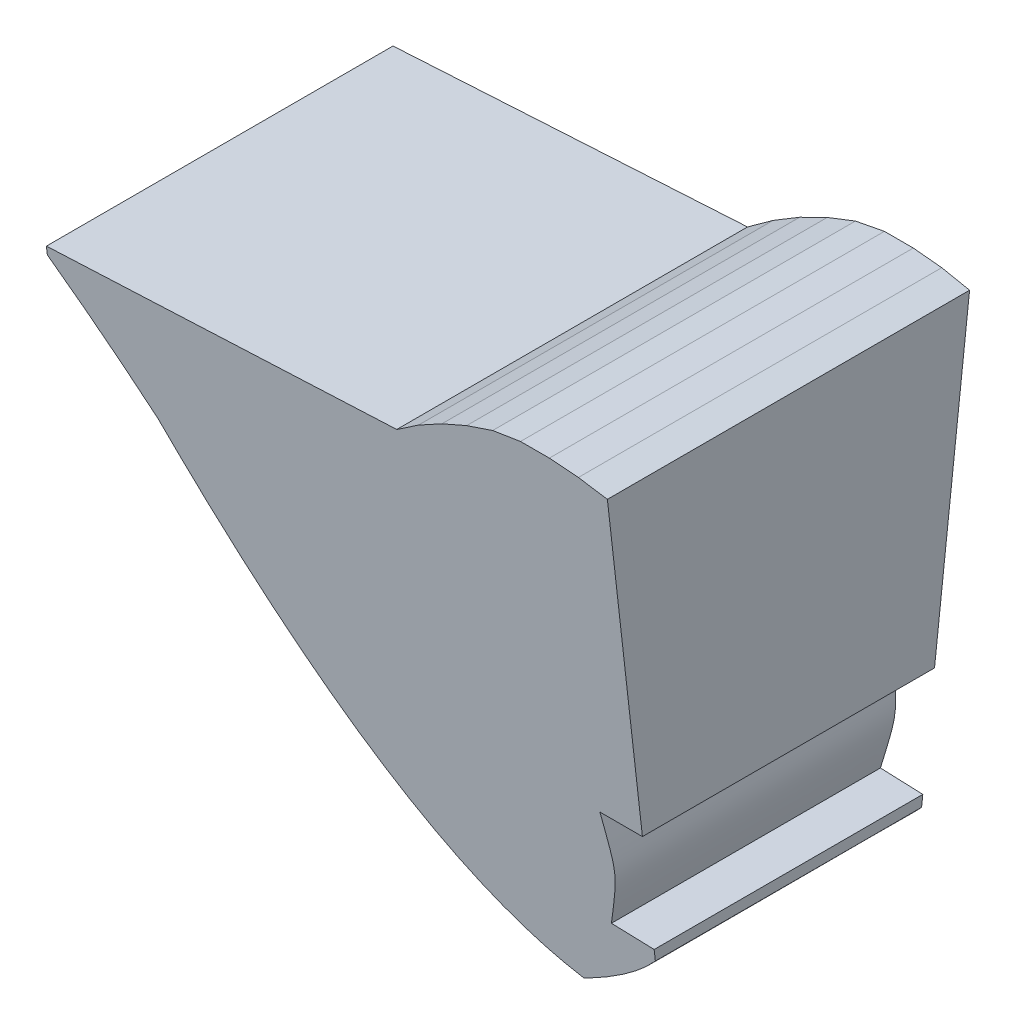
ISO-10303-21;
HEADER;
FILE_DESCRIPTION(('STEP AP214'),'2;1');
FILE_NAME('part.step','',(''),(''),'','','');
FILE_SCHEMA(('AUTOMOTIVE_DESIGN { 1 0 10303 214 1 1 1 1 }'));
ENDSEC;
DATA;
#1=APPLICATION_CONTEXT('core data for automotive mechanical design processes');
#2=APPLICATION_PROTOCOL_DEFINITION('international standard','automotive_design',2000,#1);
#3=PRODUCT_CONTEXT('',#1,'mechanical');
#4=PRODUCT('Part','Part','',(#3));
#5=PRODUCT_RELATED_PRODUCT_CATEGORY('part','',(#4));
#6=PRODUCT_DEFINITION_FORMATION('','',#4);
#7=PRODUCT_DEFINITION_CONTEXT('part definition',#1,'design');
#8=PRODUCT_DEFINITION('design','',#6,#7);
#9=PRODUCT_DEFINITION_SHAPE('','',#8);
#10=(LENGTH_UNIT() NAMED_UNIT(*) SI_UNIT(.MILLI.,.METRE.));
#11=(NAMED_UNIT(*) PLANE_ANGLE_UNIT() SI_UNIT($,.RADIAN.));
#12=(NAMED_UNIT(*) SI_UNIT($,.STERADIAN.) SOLID_ANGLE_UNIT());
#13=UNCERTAINTY_MEASURE_WITH_UNIT(LENGTH_MEASURE(1.E-05),#10,'distance_accuracy_value','');
#14=(GEOMETRIC_REPRESENTATION_CONTEXT(3) GLOBAL_UNCERTAINTY_ASSIGNED_CONTEXT((#13)) GLOBAL_UNIT_ASSIGNED_CONTEXT((#10,
#11,#12)) REPRESENTATION_CONTEXT('',''));
#15=CARTESIAN_POINT('',(0.,0.,0.));
#16=DIRECTION('',(0.,0.,1.));
#17=DIRECTION('',(1.,0.,0.));
#18=AXIS2_PLACEMENT_3D('',#15,#16,#17);
#19=CARTESIAN_POINT('',(0.355125000055651,-1.23774703808888E-13,7.21));
#20=DIRECTION('',(-1.,3.48538412642003E-13,0.));
#21=DIRECTION('',(-3.48538412642003E-13,-1.,0.));
#22=AXIS2_PLACEMENT_3D('',#19,#20,#21);
#23=PLANE('',#22);
#24=DIRECTION('',(0.,-0.993653373689782,0.112485434412263));
#25=VECTOR('',#24,1.);
#26=CARTESIAN_POINT('',(0.355125000056697,12.6081551722012,-7.21));
#27=LINE('',#26,#25);
#28=CARTESIAN_POINT('',(0.355125000056697,14.7091805414174,-7.44784426000575));
#29=VERTEX_POINT('',#28);
#30=CARTESIAN_POINT('',(0.355125000056447,1.97626956518499,-6.00642911422341));
#31=VERTEX_POINT('',#30);
#32=EDGE_CURVE('E58',#29,#31,#27,.T.);
#33=ORIENTED_EDGE('',*,*,#32,.F.);
#34=DIRECTION('',(0.,0.,-1.));
#35=VECTOR('',#34,1.);
#36=CARTESIAN_POINT('',(0.355125000056697,14.7091805414174,22.5387280312974));
#37=LINE('',#36,#35);
#38=CARTESIAN_POINT('',(0.355125000056697,14.7091805414174,7.44784426000575));
#39=VERTEX_POINT('',#38);
#40=EDGE_CURVE('E192',#39,#29,#37,.T.);
#41=ORIENTED_EDGE('',*,*,#40,.F.);
#42=DIRECTION('',(0.,0.993653373689782,0.112485434412263));
#43=VECTOR('',#42,1.);
#44=CARTESIAN_POINT('',(0.355125000056697,12.6081551722012,7.21));
#45=LINE('',#44,#43);
#46=CARTESIAN_POINT('',(0.355125000056697,1.97626956518499,6.00642911422342));
#47=VERTEX_POINT('',#46);
#48=EDGE_CURVE('E244',#47,#39,#45,.T.);
#49=ORIENTED_EDGE('',*,*,#48,.F.);
#50=DIRECTION('',(0.,0.,-1.));
#51=VECTOR('',#50,1.);
#52=CARTESIAN_POINT('',(0.355125000056447,1.97626956518499,7.21));
#53=LINE('',#52,#51);
#54=EDGE_CURVE('E316',#47,#31,#53,.T.);
#55=ORIENTED_EDGE('',*,*,#54,.T.);
#56=EDGE_LOOP('',(#33,#41,#49,#55));
#57=FACE_BOUND('',#56,.T.);
#58=ADVANCED_FACE('F43',(#57),#23,.F.);
#59=CARTESIAN_POINT('',(-23.0359211456035,0.,7.21));
#60=DIRECTION('',(-1.,0.,0.));
#61=DIRECTION('',(0.,0.,1.));
#62=AXIS2_PLACEMENT_3D('',#59,#60,#61);
#63=PLANE('',#62);
#64=DIRECTION('',(0.,0.,-1.));
#65=VECTOR('',#64,1.);
#66=CARTESIAN_POINT('',(-23.0359211456035,11.8716122879342,7.21));
#67=LINE('',#66,#65);
#68=CARTESIAN_POINT('',(-23.0359211456035,11.8716122879342,7.12662047501294));
#69=VERTEX_POINT('',#68);
#70=CARTESIAN_POINT('',(-23.0359211456035,11.8716122879342,-7.12662047501294));
#71=VERTEX_POINT('',#70);
#72=EDGE_CURVE('E325',#69,#71,#67,.T.);
#73=ORIENTED_EDGE('',*,*,#72,.T.);
#74=DIRECTION('',(0.,-0.993653373689782,0.112485434412263));
#75=VECTOR('',#74,1.);
#76=CARTESIAN_POINT('',(-23.0359211456035,12.6081551722012,-7.21));
#77=LINE('',#76,#75);
#78=CARTESIAN_POINT('',(-23.0359211456035,11.5401378200982,-7.08909627341673));
#79=VERTEX_POINT('',#78);
#80=EDGE_CURVE('E239',#71,#79,#77,.T.);
#81=ORIENTED_EDGE('',*,*,#80,.T.);
#82=DIRECTION('',(0.,0.,-1.));
#83=VECTOR('',#82,1.);
#84=CARTESIAN_POINT('',(-23.0359211456035,11.5401378200983,7.21));
#85=LINE('',#84,#83);
#86=CARTESIAN_POINT('',(-23.0359211456035,11.5401378200982,7.08909627341673));
#87=VERTEX_POINT('',#86);
#88=EDGE_CURVE('E319',#87,#79,#85,.T.);
#89=ORIENTED_EDGE('',*,*,#88,.F.);
#90=DIRECTION('',(0.,0.993653373689782,0.112485434412263));
#91=VECTOR('',#90,1.);
#92=CARTESIAN_POINT('',(-23.0359211456035,12.6081551722012,7.21));
#93=LINE('',#92,#91);
#94=EDGE_CURVE('E223',#87,#69,#93,.T.);
#95=ORIENTED_EDGE('',*,*,#94,.T.);
#96=EDGE_LOOP('',(#73,#81,#89,#95));
#97=FACE_BOUND('',#96,.T.);
#98=ADVANCED_FACE('F410',(#97),#63,.T.);
#99=CARTESIAN_POINT('',(-18.9451921135982,7.54091889574655,7.21));
#100=CARTESIAN_POINT('',(-10.2150083842792,-3.69764410322756,7.21));
#101=CARTESIAN_POINT('',(-2.84660482498738,-5.05908110388432,7.21));
#102=(BOUNDED_CURVE() B_SPLINE_CURVE(2,(#99,#100,#101),.UNSPECIFIED.,.F.,
.F.) B_SPLINE_CURVE_WITH_KNOTS((3,3),(0.497667241108509,0.499554279588011),
.UNSPECIFIED.) CURVE() GEOMETRIC_REPRESENTATION_ITEM() RATIONAL_B_SPLINE_CURVE((1.,1.,1.)) REPRESENTATION_ITEM(''));
#103=DIRECTION('',(0.,0.,-1.));
#104=VECTOR('',#103,1.);
#105=SURFACE_OF_LINEAR_EXTRUSION('',#102,#104);
#106=DIRECTION('',(0.,0.,-1.));
#107=VECTOR('',#106,1.);
#108=CARTESIAN_POINT('',(-18.9451921135982,7.54091889574657,7.21));
#109=LINE('',#108,#107);
#110=CARTESIAN_POINT('',(-18.9451921135982,7.54091889574657,6.63636910524442));
#111=VERTEX_POINT('',#110);
#112=CARTESIAN_POINT('',(-18.9451921135982,7.54091889574657,-6.63636910524442));
#113=VERTEX_POINT('',#112);
#114=EDGE_CURVE('E315',#111,#113,#109,.T.);
#115=ORIENTED_EDGE('',*,*,#114,.T.);
#116=CARTESIAN_POINT('',(-18.9451921135982,7.54091889574655,-6.63636910524441));
#117=CARTESIAN_POINT('',(-18.7033608655423,7.22962108931645,-6.60112898035273));
#118=CARTESIAN_POINT('',(-18.4592647140916,6.9200497206851,-6.56608429494821));
#119=CARTESIAN_POINT('',(-17.9661198805234,6.30464603742845,-6.49641819962467));
#120=CARTESIAN_POINT('',(-17.7170694462669,5.99881510969872,-6.46179694670763));
#121=CARTESIAN_POINT('',(-17.2137366178937,5.3913665824337,-6.39303140604553));
#122=CARTESIAN_POINT('',(-16.9594535947769,5.08974949683998,-6.35888717648066));
#123=CARTESIAN_POINT('',(-16.4451285665965,4.49103725761873,-6.29111061767257));
#124=CARTESIAN_POINT('',(-16.1850826962375,4.19394537928884,-6.25747865920581));
#125=CARTESIAN_POINT('',(-15.6590118901181,3.60508061675355,-6.1908168731366));
#126=CARTESIAN_POINT('',(-15.3929875534481,3.31330720485499,-6.15778698579723));
#127=CARTESIAN_POINT('',(-14.8544901847056,2.7357195544677,-6.09240181277284));
#128=CARTESIAN_POINT('',(-14.5820174931064,2.44990500284308,-6.06004649163962));
#129=CARTESIAN_POINT('',(-13.9777704357619,1.83142011947111,-5.99003159245484));
#130=CARTESIAN_POINT('',(-13.6445482479649,1.50014167377654,-5.95252958132897));
#131=CARTESIAN_POINT('',(-12.9673134934436,0.848664446736888,-5.87877982026175));
#132=CARTESIAN_POINT('',(-12.623301443116,0.528465136688492,-5.84253201046914));
#133=CARTESIAN_POINT('',(-11.9227759490938,-0.0995013958587514,-5.7714437516454));
#134=CARTESIAN_POINT('',(-11.5662405708663,-0.407244542107335,-5.73660602813964));
#135=CARTESIAN_POINT('',(-10.840142749037,-1.00720368374379,-5.66868831511867));
#136=CARTESIAN_POINT('',(-10.4705807273197,-1.29942018121482,-5.6356082687657));
#137=CARTESIAN_POINT('',(-9.71382699072171,-1.86779135556405,-5.57126643674768));
#138=CARTESIAN_POINT('',(-9.32650636654571,-2.14377746328672,-5.540023733768));
#139=CARTESIAN_POINT('',(-8.5360986768139,-2.67282289543975,-5.48013372902864));
#140=CARTESIAN_POINT('',(-8.13300835344273,-2.92587744631612,-5.45148696765387));
#141=CARTESIAN_POINT('',(-7.31201826568453,-3.40280761684766,-5.39749661363601));
#142=CARTESIAN_POINT('',(-6.89419365451789,-3.62680992502778,-5.37213867935817));
#143=CARTESIAN_POINT('',(-6.04187322097519,-4.0405536088069,-5.32530128189388));
#144=CARTESIAN_POINT('',(-5.60738935372736,-4.23031901573022,-5.30381909826786));
#145=CARTESIAN_POINT('',(-4.78985442909107,-4.54236533838515,-5.26849423842238));
#146=CARTESIAN_POINT('',(-4.4091055725695,-4.67052923075731,-5.25398558631979));
#147=CARTESIAN_POINT('',(-3.82960691198316,-4.83674345690554,-5.23516948814227));
#148=CARTESIAN_POINT('',(-3.63462104960687,-4.8878904691115,-5.22937944702812));
#149=CARTESIAN_POINT('',(-3.24229120544362,-4.9807402777546,-5.21886848683127));
#150=CARTESIAN_POINT('',(-3.0449461414238,-5.02243854990591,-5.21414807991536));
#151=CARTESIAN_POINT('',(-2.84660482498738,-5.05908110388432,-5.21));
#152=B_SPLINE_CURVE_WITH_KNOTS('',3,(#116,#117,#118,#119,#120,#121,#122,#123,#124,#125,#126,
#127,#128,#129,#130,#131,#132,#133,#134,#135,#136,#137,#138,#139,#140,#141,#142,#143,#144,#145,
#146,#147,#148,#149,#150,#151),.UNSPECIFIED.,.F.,.F.,(4,2,2,2,2,2,2,2,2,2,2,2,2,2,2,2,2,4),(0.,
1.1872997216569,2.37502708567824,3.56289806807204,4.75159146291787,5.9401662676152,
7.12867845491363,8.54255640265696,9.95636678593971,11.3727907462706,12.7891688759803,
14.2183172044781,15.6477623519031,17.0707480146133,18.4927309460623,19.6971402338765,
20.3019233237111,20.9069953892921),.UNSPECIFIED.);
#153=CARTESIAN_POINT('',(-2.84660482498738,-5.05908110388432,-5.21));
#154=VERTEX_POINT('',#153);
#155=EDGE_CURVE('E356',#113,#154,#152,.T.);
#156=ORIENTED_EDGE('',*,*,#155,.T.);
#157=DIRECTION('',(0.,0.,-1.));
#158=VECTOR('',#157,1.);
#159=CARTESIAN_POINT('',(-2.84660482498738,-5.05908110388432,7.21));
#160=LINE('',#159,#158);
#161=CARTESIAN_POINT('',(-2.84660482498738,-5.05908110388432,5.21));
#162=VERTEX_POINT('',#161);
#163=EDGE_CURVE('E340',#162,#154,#160,.T.);
#164=ORIENTED_EDGE('',*,*,#163,.F.);
#165=CARTESIAN_POINT('',(-2.84660482498738,-5.05908110388432,5.21));
#166=CARTESIAN_POINT('',(-3.0836355452615,-5.01529762547054,5.21495646039138));
#167=CARTESIAN_POINT('',(-3.31925014057108,-4.96428184629726,5.22073164541478));
#168=CARTESIAN_POINT('',(-3.78628189704186,-4.84911384389608,5.23376911212451));
#169=CARTESIAN_POINT('',(-4.01771143135529,-4.78501130060695,5.24102576984815));
#170=CARTESIAN_POINT('',(-4.47638324853452,-4.64477679089168,5.25690086287615));
#171=CARTESIAN_POINT('',(-4.70363211310206,-4.56866593727755,5.26551690812791));
#172=CARTESIAN_POINT('',(-5.1539801611568,-4.40545252874729,5.28399330205617));
#173=CARTESIAN_POINT('',(-5.37708095327682,-4.31835434125152,5.29385315632366));
#174=CARTESIAN_POINT('',(-5.81545834234536,-4.13567110279715,5.31453361087802));
#175=CARTESIAN_POINT('',(-6.03080317783365,-4.04024711994086,5.32533597762798));
#176=CARTESIAN_POINT('',(-6.45748946905634,-3.84057736608456,5.34793937192645));
#177=CARTESIAN_POINT('',(-6.66882789943329,-3.73632522989765,5.35974112003892));
#178=CARTESIAN_POINT('',(-7.08747417766979,-3.51983158147829,5.38424904476877));
#179=CARTESIAN_POINT('',(-7.29477947597257,-3.40758521204135,5.39695577124062));
#180=CARTESIAN_POINT('',(-7.70530843131035,-3.17590609220346,5.42318275051655));
#181=CARTESIAN_POINT('',(-7.90853147430462,-3.0564722713248,5.43670312450288));
#182=CARTESIAN_POINT('',(-8.45410340689061,-2.72385368196738,5.47435684511425));
#183=CARTESIAN_POINT('',(-8.79259906035209,-2.50440768840731,5.49919898682003));
#184=CARTESIAN_POINT('',(-9.45845448583479,-2.04949644973372,5.5506967119384));
#185=CARTESIAN_POINT('',(-9.78581359629267,-1.81403025542841,5.5773524028032));
#186=CARTESIAN_POINT('',(-10.4302582396863,-1.32938575303013,5.63221604925302));
#187=CARTESIAN_POINT('',(-10.7473396395034,-1.08020203459831,5.66042461730948));
#188=CARTESIAN_POINT('',(-11.3718438106499,-0.570176876647104,5.71816145288252));
#189=CARTESIAN_POINT('',(-11.6792662750814,-0.309335067346119,5.74768976225981));
#190=CARTESIAN_POINT('',(-12.2887351366992,0.225514030316342,5.80823676455314));
#191=CARTESIAN_POINT('',(-12.5906756597182,0.499640146613562,5.83926890925461));
#192=CARTESIAN_POINT('',(-13.1859914625247,1.05668157973797,5.90232817041119));
#193=CARTESIAN_POINT('',(-13.4793699933214,1.33959347409339,5.93435489942917));
#194=CARTESIAN_POINT('',(-14.0582984741035,1.91313890151101,5.99928247705986));
#195=CARTESIAN_POINT('',(-14.3438493181123,2.20377154523463,6.03218322499598));
#196=CARTESIAN_POINT('',(-14.9077244427009,2.7918210558895,6.09875272137508));
#197=CARTESIAN_POINT('',(-15.1860493084316,3.08923736980037,6.13242140721399));
#198=CARTESIAN_POINT('',(-15.7683607406539,3.72540309630891,6.20443784674841));
#199=CARTESIAN_POINT('',(-16.0715178451228,4.06490144250158,6.24287038264565));
#200=CARTESIAN_POINT('',(-16.6701836985208,4.7504922746204,6.32048193675692));
#201=CARTESIAN_POINT('',(-16.9656923307507,5.09658486102068,6.35966096634501));
#202=CARTESIAN_POINT('',(-17.4495199616275,5.67490501691598,6.42512906184765));
#203=CARTESIAN_POINT('',(-17.6398456690967,5.90547984199544,6.45123103065322));
#204=CARTESIAN_POINT('',(-18.0176052393411,6.36895711711416,6.50369846448112));
#205=CARTESIAN_POINT('',(-18.205039097963,6.60185957049552,6.5300639298818));
#206=CARTESIAN_POINT('',(-18.5771476687389,7.06981539005112,6.58303835239394));
#207=CARTESIAN_POINT('',(-18.7618224957771,7.30486866600559,6.60964729929217));
#208=CARTESIAN_POINT('',(-18.9451921135982,7.54091889574655,6.63636910524441));
#209=B_SPLINE_CURVE_WITH_KNOTS('',3,(#165,#166,#167,#168,#169,#170,#171,#172,#173,#174,#175,
#176,#177,#178,#179,#180,#181,#182,#183,#184,#185,#186,#187,#188,#189,#190,#191,#192,#193,#194,
#195,#196,#197,#198,#199,#200,#201,#202,#203,#204,#205,#206,#207,#208),.UNSPECIFIED.,.F.,.F.,(4,
2,2,2,2,2,2,2,2,2,2,2,2,2,2,2,2,2,2,2,2,4),(0.,0.723070627629283,1.44344574109941,
2.16256813451498,2.88140557514503,3.58855192345824,4.2962125448096,5.0043068623572,
5.71250690363926,6.92441762508089,8.13640021448464,9.3488642962315,10.5613668633146,
11.788141520998,13.0144441434254,14.2406061176645,15.4666684871313,16.8368576095009,
18.2070676256843,19.1073954524656,20.0077245721621,20.9080160976373),.UNSPECIFIED.);
#210=EDGE_CURVE('E274',#162,#111,#209,.T.);
#211=ORIENTED_EDGE('',*,*,#210,.T.);
#212=EDGE_LOOP('',(#115,#156,#164,#211));
#213=FACE_BOUND('',#212,.T.);
#214=ADVANCED_FACE('F44',(#213),#105,.F.);
#215=CARTESIAN_POINT('',(-2.84660482498738,-5.05908110388432,7.21));
#216=CARTESIAN_POINT('',(-0.742366881974002,-3.93520659958673,7.21));
#217=CARTESIAN_POINT('',(0.355124999965198,-2.72325322699678,7.21));
#218=(BOUNDED_CURVE() B_SPLINE_CURVE(2,(#215,#216,#217),.UNSPECIFIED.,.F.,
.F.) B_SPLINE_CURVE_WITH_KNOTS((3,3),(0.498812074629495,0.499412845463797),
.UNSPECIFIED.) CURVE() GEOMETRIC_REPRESENTATION_ITEM() RATIONAL_B_SPLINE_CURVE((1.,1.,1.)) REPRESENTATION_ITEM(''));
#219=DIRECTION('',(0.,0.,-1.));
#220=VECTOR('',#219,1.);
#221=SURFACE_OF_LINEAR_EXTRUSION('',#218,#220);
#222=ORIENTED_EDGE('',*,*,#163,.T.);
#223=CARTESIAN_POINT('',(-2.84660482498738,-5.05908110388432,-5.21));
#224=CARTESIAN_POINT('',(-2.67154367534484,-4.96554243060771,-5.22058894235803));
#225=CARTESIAN_POINT('',(-2.49778385523126,-4.86952307483158,-5.23145870764283));
#226=CARTESIAN_POINT('',(-2.15332890723938,-4.67164155861341,-5.25385966647147));
#227=CARTESIAN_POINT('',(-1.9826387176766,-4.56977092703724,-5.26539181898071));
#228=CARTESIAN_POINT('',(-1.64527137465746,-4.35955519460265,-5.2891890591545));
#229=CARTESIAN_POINT('',(-1.47859514121983,-4.25120862887406,-5.30145431264808));
#230=CARTESIAN_POINT('',(-1.15044448784201,-4.02724001195876,-5.32680843294344));
#231=CARTESIAN_POINT('',(-0.98896568487432,-3.911624347545,-5.33989657673763));
#232=CARTESIAN_POINT('',(-0.724614348138144,-3.7114805449727,-5.36255363519824));
#233=CARTESIAN_POINT('',(-0.619967455079453,-3.6292658395869,-5.37186066025876));
#234=CARTESIAN_POINT('',(-0.414118763296717,-3.46070156785231,-5.39094279275538));
#235=CARTESIAN_POINT('',(-0.312916415666604,-3.3743526656372,-5.40071782500895));
#236=CARTESIAN_POINT('',(-0.114288127047668,-3.19685300163986,-5.42081147873311));
#237=CARTESIAN_POINT('',(-0.0168745915935634,-3.10568844995875,-5.431131661274));
#238=CARTESIAN_POINT('',(0.173044677325633,-2.91833195578561,-5.45234114658855));
#239=CARTESIAN_POINT('',(0.265547074526193,-2.82213668167119,-5.46323082651485));
#240=CARTESIAN_POINT('',(0.355124999965198,-2.72325322699678,-5.47442481895704));
#241=B_SPLINE_CURVE_WITH_KNOTS('',3,(#223,#224,#225,#226,#227,#228,#229,#230,#231,#232,#233,
#234,#235,#236,#237,#238,#239,#240),.UNSPECIFIED.,.F.,.F.,(4,2,2,2,2,2,2,2,4),(0.,
0.596333361221147,1.19355295493407,1.79090815604603,2.38774565156578,2.78786762990545,
3.18792554534165,3.58919872466333,3.99074110013676),.UNSPECIFIED.);
#242=CARTESIAN_POINT('',(0.355125000010947,-2.72325322699678,-5.47442481895703));
#243=VERTEX_POINT('',#242);
#244=EDGE_CURVE('E362',#154,#243,#241,.T.);
#245=ORIENTED_EDGE('',*,*,#244,.T.);
#246=DIRECTION('',(0.,0.,-1.));
#247=VECTOR('',#246,1.);
#248=CARTESIAN_POINT('',(0.355124999965198,-2.72325322699678,7.21));
#249=LINE('',#248,#247);
#250=CARTESIAN_POINT('',(0.355125000010947,-2.72325322699678,5.47442481895703));
#251=VERTEX_POINT('',#250);
#252=EDGE_CURVE('E332',#251,#243,#249,.T.);
#253=ORIENTED_EDGE('',*,*,#252,.F.);
#254=CARTESIAN_POINT('',(0.355124999965198,-2.72325322699678,5.47442481895703));
#255=CARTESIAN_POINT('',(0.288265800066398,-2.79707578870119,5.46606781726749));
#256=CARTESIAN_POINT('',(0.219762299322532,-2.86939557158838,5.45788093599675));
#257=CARTESIAN_POINT('',(0.0798741499126208,-3.0111837154317,5.44182996553056));
#258=CARTESIAN_POINT('',(0.00849051694650479,-3.08065306448068,5.43396576447915));
#259=CARTESIAN_POINT('',(-0.209110404202349,-3.28478130911614,5.41085765164865));
#260=CARTESIAN_POINT('',(-0.359086186155244,-3.41549544786354,5.39606030171743));
#261=CARTESIAN_POINT('',(-0.666431647279958,-3.66745151891472,5.36753789253992));
#262=CARTESIAN_POINT('',(-0.823790135326829,-3.78870709059741,5.35381128926277));
#263=CARTESIAN_POINT('',(-1.14463764434189,-4.02329424679429,5.32725510893767));
#264=CARTESIAN_POINT('',(-1.30813354467851,-4.13661650521983,5.31442658763929));
#265=CARTESIAN_POINT('',(-1.58497175174893,-4.31986712055689,5.29368190381061));
#266=CARTESIAN_POINT('',(-1.69701528140079,-4.39175032218513,5.28554444523986));
#267=CARTESIAN_POINT('',(-1.92294333828473,-4.53261962763427,5.26959749086083));
#268=CARTESIAN_POINT('',(-2.03682799400811,-4.6016055280346,5.26178801808056));
#269=CARTESIAN_POINT('',(-2.26591352019373,-4.73675126913538,5.24648899349189));
#270=CARTESIAN_POINT('',(-2.38111062922232,-4.80291742324192,5.23899872698133));
#271=CARTESIAN_POINT('',(-2.6128736149529,-4.93278949726635,5.22429670205848));
#272=CARTESIAN_POINT('',(-2.72943923096306,-4.99649587614853,5.21708489168965));
#273=CARTESIAN_POINT('',(-2.84660482498738,-5.05908110388432,5.21));
#274=B_SPLINE_CURVE_WITH_KNOTS('',3,(#254,#255,#256,#257,#258,#259,#260,#261,#262,#263,#264,
#265,#266,#267,#268,#269,#270,#271,#272,#273),.UNSPECIFIED.,.F.,.F.,(4,2,2,2,2,2,2,2,2,4),(0.,
0.299782926841572,0.599461041577767,1.1974499434567,1.79455995327913,2.39236050766276,
2.79242459253001,3.19251671924541,3.59166012626068,3.99072869445439),.UNSPECIFIED.);
#275=EDGE_CURVE('E279',#251,#162,#274,.T.);
#276=ORIENTED_EDGE('',*,*,#275,.T.);
#277=EDGE_LOOP('',(#222,#245,#253,#276));
#278=FACE_BOUND('',#277,.T.);
#279=ADVANCED_FACE('F286',(#278),#221,.F.);
#280=CARTESIAN_POINT('',(0.355125000532009,-7.39148800447813E-11,7.21));
#281=DIRECTION('',(1.,-2.08137641489758E-10,0.));
#282=DIRECTION('',(2.08137641489758E-10,1.,0.));
#283=AXIS2_PLACEMENT_3D('',#280,#281,#282);
#284=PLANE('',#283);
#285=CARTESIAN_POINT('',(0.355125000056697,-2.28484178142546,-5.52405470319249));
#286=VERTEX_POINT('',#285);
#287=EDGE_CURVE('E240',#286,#243,#27,.T.);
#288=ORIENTED_EDGE('',*,*,#287,.F.);
#289=DIRECTION('',(0.,0.,-1.));
#290=VECTOR('',#289,1.);
#291=CARTESIAN_POINT('',(0.355125000056447,-2.28484178142545,7.21));
#292=LINE('',#291,#290);
#293=CARTESIAN_POINT('',(0.355125000056697,-2.28484178142546,5.52405470319249));
#294=VERTEX_POINT('',#293);
#295=EDGE_CURVE('E331',#294,#286,#292,.T.);
#296=ORIENTED_EDGE('',*,*,#295,.F.);
#297=EDGE_CURVE('E237',#251,#294,#45,.T.);
#298=ORIENTED_EDGE('',*,*,#297,.F.);
#299=ORIENTED_EDGE('',*,*,#252,.T.);
#300=EDGE_LOOP('',(#288,#296,#298,#299));
#301=FACE_BOUND('',#300,.T.);
#302=ADVANCED_FACE('F294',(#301),#284,.T.);
#303=CARTESIAN_POINT('',(-0.0792587195419091,-2.26967276768239,7.21));
#304=DIRECTION('',(-0.0348994967024901,-0.999390827019096,0.));
#305=DIRECTION('',(0.999390827019096,-0.0348994967024901,0.));
#306=AXIS2_PLACEMENT_3D('',#303,#304,#305);
#307=PLANE('',#306);
#308=ORIENTED_EDGE('',*,*,#295,.T.);
#309=DIRECTION('',(-0.999383027616045,0.034899224341334,-0.00395072820626436));
#310=VECTOR('',#309,1.);
#311=CARTESIAN_POINT('',(-0.0289741896082848,-2.2714287421612,-5.52557311151111));
#312=LINE('',#311,#310);
#313=CARTESIAN_POINT('',(-1.39487499994356,-2.22373043481491,-5.5309727457947));
#314=VERTEX_POINT('',#313);
#315=EDGE_CURVE('E347',#286,#314,#312,.T.);
#316=ORIENTED_EDGE('',*,*,#315,.T.);
#317=DIRECTION('',(0.,0.,-1.));
#318=VECTOR('',#317,1.);
#319=CARTESIAN_POINT('',(-1.39487499994356,-2.22373043481491,7.21));
#320=LINE('',#319,#318);
#321=CARTESIAN_POINT('',(-1.39487499994356,-2.22373043481491,5.5309727457947));
#322=VERTEX_POINT('',#321);
#323=EDGE_CURVE('E329',#322,#314,#320,.T.);
#324=ORIENTED_EDGE('',*,*,#323,.F.);
#325=DIRECTION('',(0.999383027616045,-0.034899224341334,-0.00395072820626436));
#326=VECTOR('',#325,1.);
#327=CARTESIAN_POINT('',(-0.0859085417339361,-2.26944055077446,5.52579818252456));
#328=LINE('',#327,#326);
#329=EDGE_CURVE('E251',#322,#294,#328,.T.);
#330=ORIENTED_EDGE('',*,*,#329,.T.);
#331=EDGE_LOOP('',(#308,#316,#324,#330));
#332=FACE_BOUND('',#331,.T.);
#333=ADVANCED_FACE('F420',(#332),#307,.F.);
#334=CARTESIAN_POINT('',(-1.39487499994356,-2.22373043481491,7.21));
#335=CARTESIAN_POINT('',(-0.907530669798052,-0.123730434814926,7.21));
#336=CARTESIAN_POINT('',(-1.39487499994356,1.976269565185,7.21));
#337=(BOUNDED_CURVE() B_SPLINE_CURVE(2,(#334,#335,#336),.UNSPECIFIED.,.F.,
.F.) B_SPLINE_CURVE_WITH_KNOTS((3,3),(0.,1.),
.UNSPECIFIED.) CURVE() GEOMETRIC_REPRESENTATION_ITEM() RATIONAL_B_SPLINE_CURVE((1.,
3.23180121851367,1.)) REPRESENTATION_ITEM(''));
#338=DIRECTION('',(0.,0.,-1.));
#339=VECTOR('',#338,1.);
#340=SURFACE_OF_LINEAR_EXTRUSION('',#337,#339);
#341=ORIENTED_EDGE('',*,*,#323,.T.);
#342=CARTESIAN_POINT('',(-1.39487499994356,-2.22373043481491,-5.5309727457947));
#343=CARTESIAN_POINT('',(-1.38202447122813,-2.16835021356968,-5.53724200266994));
#344=CARTESIAN_POINT('',(-1.36921744547373,-2.11295996104296,-5.54351239512535));
#345=CARTESIAN_POINT('',(-1.34371955909939,-2.00215267308472,-5.55605621196536));
#346=CARTESIAN_POINT('',(-1.33102869927897,-1.94673563747162,-5.56232963637053));
#347=CARTESIAN_POINT('',(-1.30579250980865,-1.83586894873068,-5.57488017761064));
#348=CARTESIAN_POINT('',(-1.29324717983284,-1.78041929567618,-5.58115729443729));
#349=CARTESIAN_POINT('',(-1.26834035470031,-1.66945670178657,-5.593718692514));
#350=CARTESIAN_POINT('',(-1.25597893242913,-1.61394374477822,-5.60000297559494));
#351=CARTESIAN_POINT('',(-1.23150428056634,-1.50286329328951,-5.61257771561119));
#352=CARTESIAN_POINT('',(-1.21939105277074,-1.44729579841754,-5.61886817259083));
#353=CARTESIAN_POINT('',(-1.19550012207595,-1.33608743052918,-5.63145739324204));
#354=CARTESIAN_POINT('',(-1.1837224309966,-1.2804465549999,-5.63775615719808));
#355=CARTESIAN_POINT('',(-1.15485704104805,-1.14125615214793,-5.65351305326002));
#356=CARTESIAN_POINT('',(-1.13805530724695,-1.05764770999797,-5.66297785475397));
#357=CARTESIAN_POINT('',(-1.10616760722362,-0.890046794372652,-5.68195093158457));
#358=CARTESIAN_POINT('',(-1.09108267359643,-0.806054121054038,-5.69145922954426));
#359=CARTESIAN_POINT('',(-1.06839764881353,-0.664871544058104,-5.70744164748328));
#360=CARTESIAN_POINT('',(-1.05995626751594,-0.607817685780514,-5.71390036659317));
#361=CARTESIAN_POINT('',(-1.04516806244473,-0.493450404650502,-5.72684718853439));
#362=CARTESIAN_POINT('',(-1.03882061818002,-0.436137063802354,-5.73333528208253));
#363=CARTESIAN_POINT('',(-1.02903068414648,-0.32130807468907,-5.74633437116685));
#364=CARTESIAN_POINT('',(-1.02558541499307,-0.263792673078832,-5.75284533878074));
#365=CARTESIAN_POINT('',(-1.02222407231355,-0.148714957691158,-5.76587258464866));
#366=CARTESIAN_POINT('',(-1.02230420900467,-0.0911527608046728,-5.77238884967019));
#367=CARTESIAN_POINT('',(-1.02596900528622,0.0239015023985969,-5.78541344065945));
#368=CARTESIAN_POINT('',(-1.02955657044098,0.0813934710005598,-5.79192175556548));
#369=CARTESIAN_POINT('',(-1.03959132289802,0.19613338530381,-5.80491076103415));
#370=CARTESIAN_POINT('',(-1.04603929917214,0.253381259276289,-5.81139144347682));
#371=CARTESIAN_POINT('',(-1.05997220439613,0.35983137212623,-5.8234420111136));
#372=CARTESIAN_POINT('',(-1.06719667195452,0.409068491171902,-5.82901584487869));
#373=CARTESIAN_POINT('',(-1.08274764683563,0.507347946837772,-5.84014146227917));
#374=CARTESIAN_POINT('',(-1.0910737056158,0.556390354412903,-5.84569325394695));
#375=CARTESIAN_POINT('',(-1.10853037258208,0.654424381213792,-5.85679108784343));
#376=CARTESIAN_POINT('',(-1.11766242226862,0.70341574413319,-5.86233710105724));
#377=CARTESIAN_POINT('',(-1.1364977866421,0.801294033672846,-5.8734173048888));
#378=CARTESIAN_POINT('',(-1.14620115522269,0.850180949988233,-5.87895149433999));
#379=CARTESIAN_POINT('',(-1.16833495400599,0.959258362431623,-5.89129948252998));
#380=CARTESIAN_POINT('',(-1.1808737668477,1.01942705832357,-5.89811081339709));
#381=CARTESIAN_POINT('',(-1.20639174214038,1.13967062360228,-5.91172285360526));
#382=CARTESIAN_POINT('',(-1.21937089694786,1.19974549459873,-5.91852356312855));
#383=CARTESIAN_POINT('',(-1.24564626429316,1.31982703510014,-5.93211726150049));
#384=CARTESIAN_POINT('',(-1.2589424791072,1.37983370411223,-5.93891025029334));
#385=CARTESIAN_POINT('',(-1.28569888355067,1.49948275843749,-5.95245498954463));
#386=CARTESIAN_POINT('',(-1.29915785770072,1.55912541262012,-5.95920677044014));
#387=CARTESIAN_POINT('',(-1.32625009614692,1.67837055204035,-5.97270578495002));
#388=CARTESIAN_POINT('',(-1.33988335761136,1.73797303791406,-5.97945301863641));
#389=CARTESIAN_POINT('',(-1.36728618039678,1.85714403003134,-5.99294363938264));
#390=CARTESIAN_POINT('',(-1.381055735056,1.91671253778666,-5.9996870266136));
#391=CARTESIAN_POINT('',(-1.39487499994356,1.976269565185,-6.00642911422342));
#392=B_SPLINE_CURVE_WITH_KNOTS('',3,(#342,#343,#344,#345,#346,#347,#348,#349,#350,#351,#352,
#353,#354,#355,#356,#357,#358,#359,#360,#361,#362,#363,#364,#365,#366,#367,#368,#369,#370,#371,
#372,#373,#374,#375,#376,#377,#378,#379,#380,#381,#382,#383,#384,#385,#386,#387,#388,#389,#390,
#391),.UNSPECIFIED.,.F.,.F.,(4,2,2,2,2,2,2,2,2,2,2,2,2,2,2,2,2,2,2,2,2,2,2,2,4),(0.,
0.171588763273453,0.343178706622211,0.514768265617105,0.686424107910212,0.858081191922479,
1.02974431538338,1.28714724145325,1.54470417716685,1.71878537631805,1.8928149439917,
2.06667765516018,2.24035346989174,2.41417328020677,2.58804106414591,2.73825198714263,
2.88840193486919,3.03882608638502,3.18926445051695,3.37477476712053,3.56028186526787,
3.74579029559563,3.93033206952695,4.11487084894101,4.29940065253389),.UNSPECIFIED.);
#393=CARTESIAN_POINT('',(-1.39487499994356,1.976269565185,-6.00642911422342));
#394=VERTEX_POINT('',#393);
#395=EDGE_CURVE('E350',#314,#394,#392,.T.);
#396=ORIENTED_EDGE('',*,*,#395,.T.);
#397=DIRECTION('',(0.,0.,-1.));
#398=VECTOR('',#397,1.);
#399=CARTESIAN_POINT('',(-1.39487499994356,1.976269565185,7.21));
#400=LINE('',#399,#398);
#401=CARTESIAN_POINT('',(-1.39487499994356,1.976269565185,6.00642911422342));
#402=VERTEX_POINT('',#401);
#403=EDGE_CURVE('E324',#402,#394,#400,.T.);
#404=ORIENTED_EDGE('',*,*,#403,.F.);
#405=CARTESIAN_POINT('',(-1.39487499994356,1.976269565185,6.00642911422342));
#406=CARTESIAN_POINT('',(-1.37907511533365,1.90817072448153,5.99872006005792));
#407=CARTESIAN_POINT('',(-1.36333836969219,1.84005724657732,5.99100934890426));
#408=CARTESIAN_POINT('',(-1.33204781411177,1.703774616767,5.97558162408294));
#409=CARTESIAN_POINT('',(-1.31649404111311,1.63560545649229,5.96786460946793));
#410=CARTESIAN_POINT('',(-1.28563112684324,1.49920642241426,5.95242370722985));
#411=CARTESIAN_POINT('',(-1.27032200601989,1.43097654403409,5.94469981908867));
#412=CARTESIAN_POINT('',(-1.2399275173513,1.29390485970128,5.92918277022027));
#413=CARTESIAN_POINT('',(-1.22484485449072,1.22506245970345,5.92138954224482));
#414=CARTESIAN_POINT('',(-1.19518112320204,1.0872751663326,5.90579148364441));
#415=CARTESIAN_POINT('',(-1.18060002365467,1.01833027959621,5.89798665377074));
#416=CARTESIAN_POINT('',(-1.1521828568661,0.880291295746957,5.88236010282727));
#417=CARTESIAN_POINT('',(-1.13834675067045,0.81119720663251,5.87453838266293));
#418=CARTESIAN_POINT('',(-1.11516473949854,0.690174385789182,5.86083812768789));
#419=CARTESIAN_POINT('',(-1.10556404533104,0.638294159941606,5.85496508393199));
#420=CARTESIAN_POINT('',(-1.08728934318226,0.534373551286744,5.8432008660282));
#421=CARTESIAN_POINT('',(-1.07861528667302,0.482333177013413,5.83730969284637));
#422=CARTESIAN_POINT('',(-1.06260440200736,0.378149691610768,5.82551571627023));
#423=CARTESIAN_POINT('',(-1.05526500549272,0.326006977236309,5.81961295779011));
#424=CARTESIAN_POINT('',(-1.04244257361275,0.221494061638693,5.80778168843203));
#425=CARTESIAN_POINT('',(-1.03695934618146,0.169123884520429,5.80185318028283));
#426=CARTESIAN_POINT('',(-1.02917052981484,0.0729301509045451,5.79096367474698));
#427=CARTESIAN_POINT('',(-1.02648754730517,0.029137538921467,5.78600618039996));
#428=CARTESIAN_POINT('',(-1.02311803398459,-0.0585228047861233,5.77608268785843));
#429=CARTESIAN_POINT('',(-1.02243133042271,-0.10239052968188,5.77111669043696));
#430=CARTESIAN_POINT('',(-1.02313587995194,-0.190112899664058,5.76118617627941));
#431=CARTESIAN_POINT('',(-1.02452732528276,-0.233967543165022,5.75622165972282));
#432=CARTESIAN_POINT('',(-1.02922830316647,-0.321575626235211,5.74630408328911));
#433=CARTESIAN_POINT('',(-1.03253802615093,-0.365329055323648,5.74135102459847));
#434=CARTESIAN_POINT('',(-1.04481913269156,-0.496026010219698,5.72655561994619));
#435=CARTESIAN_POINT('',(-1.05614963950478,-0.582745183351363,5.71673867158183));
#436=CARTESIAN_POINT('',(-1.08246686740171,-0.755641929816293,5.69716608606103));
#437=CARTESIAN_POINT('',(-1.09745579058543,-0.84181914476287,5.68741048947536));
#438=CARTESIAN_POINT('',(-1.129420439335,-1.01366509487317,5.66795685819712));
#439=CARTESIAN_POINT('',(-1.14639302616418,-1.09933441387988,5.65825875741124));
#440=CARTESIAN_POINT('',(-1.18149622255001,-1.27039766561497,5.63889373063944));
#441=CARTESIAN_POINT('',(-1.19962634896168,-1.35579169781193,5.62922679339328));
#442=CARTESIAN_POINT('',(-1.24641099322308,-1.57177275123237,5.60477689641502));
#443=CARTESIAN_POINT('',(-1.2755379218154,-1.70225834502177,5.59000541866374));
#444=CARTESIAN_POINT('',(-1.31987060164556,-1.89787014932725,5.56786140006925));
#445=CARTESIAN_POINT('',(-1.33475842772637,-1.96306843680887,5.56048069983263));
#446=CARTESIAN_POINT('',(-1.36470186719661,-2.09342597092531,5.54572371893541));
#447=CARTESIAN_POINT('',(-1.37975747811874,-2.15858521811941,5.53834743821149));
#448=CARTESIAN_POINT('',(-1.39487499994356,-2.22373043481491,5.5309727457947));
#449=B_SPLINE_CURVE_WITH_KNOTS('',3,(#405,#406,#407,#408,#409,#410,#411,#412,#413,#414,#415,
#416,#417,#418,#419,#420,#421,#422,#423,#424,#425,#426,#427,#428,#429,#430,#431,#432,#433,#434,
#435,#436,#437,#438,#439,#440,#441,#442,#443,#444,#445,#446,#447,#448),.UNSPECIFIED.,.F.,.F.,(4,
2,2,2,2,2,2,2,2,2,2,2,2,2,2,2,2,2,2,2,2,4),(0.,0.210994688118994,0.422031267037357,
0.633085392962154,0.845798629208893,1.05849864386888,1.27118752598179,1.4304428147189,
1.58968975917224,1.7486269361582,1.90754766218714,2.03996993828288,2.1723807546786,
2.3048038205294,2.43724003455642,2.70109168787962,2.96510255404671,3.22870119353186,
3.49219051999256,3.89571487778355,4.09756249770236,4.29940715332609),.UNSPECIFIED.);
#450=EDGE_CURVE('E70',#402,#322,#449,.T.);
#451=ORIENTED_EDGE('',*,*,#450,.T.);
#452=EDGE_LOOP('',(#341,#396,#404,#451));
#453=FACE_BOUND('',#452,.T.);
#454=ADVANCED_FACE('F256',(#453),#340,.F.);
#455=CARTESIAN_POINT('',(-0.683557287645435,13.0430500394562,7.21));
#456=DIRECTION('',(0.0523359562429403,-0.998629534754574,0.));
#457=DIRECTION('',(0.998629534754574,0.0523359562429403,0.));
#458=AXIS2_PLACEMENT_3D('',#455,#456,#457);
#459=PLANE('',#458);
#460=DIRECTION('',(0.998612008623237,0.0523350377373175,0.00592453023432517));
#461=VECTOR('',#460,1.);
#462=CARTESIAN_POINT('',(-0.683848558053945,13.0430347746209,7.25923006582624));
#463=LINE('',#462,#461);
#464=CARTESIAN_POINT('',(-8.54137771045794,12.6312391210917,7.21261319297821));
#465=VERTEX_POINT('',#464);
#466=EDGE_CURVE('E288',#69,#465,#463,.T.);
#467=ORIENTED_EDGE('',*,*,#466,.T.);
#468=DIRECTION('',(0.,0.,-1.));
#469=VECTOR('',#468,1.);
#470=CARTESIAN_POINT('',(-8.54137771045794,12.6312391210917,22.5387280312974));
#471=LINE('',#470,#469);
#472=CARTESIAN_POINT('',(-8.54137771045794,12.6312391210917,-7.21261319297821));
#473=VERTEX_POINT('',#472);
#474=EDGE_CURVE('E200',#465,#473,#471,.T.);
#475=ORIENTED_EDGE('',*,*,#474,.T.);
#476=DIRECTION('',(-0.998612008623237,-0.0523350377373175,0.00592453023432517));
#477=VECTOR('',#476,1.);
#478=CARTESIAN_POINT('',(-0.769161705533953,13.0385637020178,-7.25872392298271));
#479=LINE('',#478,#477);
#480=EDGE_CURVE('E375',#473,#71,#479,.T.);
#481=ORIENTED_EDGE('',*,*,#480,.T.);
#482=ORIENTED_EDGE('',*,*,#72,.F.);
#483=EDGE_LOOP('',(#467,#475,#481,#482));
#484=FACE_BOUND('',#483,.T.);
#485=ADVANCED_FACE('F407',(#484),#459,.F.);
#486=CARTESIAN_POINT('',(-69.8841339427642,-40.4718315495759,7.21));
#487=DIRECTION('',(0.,0.,-1.));
#488=DIRECTION('',(-1.,0.,0.));
#489=AXIS2_PLACEMENT_3D('',#486,#487,#488);
#490=CYLINDRICAL_SURFACE('',#489,69.9999999999998);
#491=CARTESIAN_POINT('',(-69.8841339427642,-40.4718315495759,-1.20113863738535));
#492=DIRECTION('',(0.,0.112485434412263,0.993653373689781));
#493=DIRECTION('',(0.,0.993653373689782,-0.112485434412263));
#494=AXIS2_PLACEMENT_3D('',#491,#492,#493);
#495=ELLIPSE('',#494,70.4471014273976,69.9999999999998);
#496=EDGE_CURVE('E349',#113,#79,#495,.T.);
#497=ORIENTED_EDGE('',*,*,#496,.F.);
#498=ORIENTED_EDGE('',*,*,#114,.F.);
#499=CARTESIAN_POINT('',(-69.8841339427642,-40.4718315495759,1.20113863738535));
#500=DIRECTION('',(0.,0.112485434412263,-0.993653373689781));
#501=DIRECTION('',(0.,-0.993653373689782,-0.112485434412263));
#502=AXIS2_PLACEMENT_3D('',#499,#500,#501);
#503=ELLIPSE('',#502,70.4471014273976,69.9999999999998);
#504=EDGE_CURVE('E281',#87,#111,#503,.T.);
#505=ORIENTED_EDGE('',*,*,#504,.F.);
#506=ORIENTED_EDGE('',*,*,#88,.T.);
#507=EDGE_LOOP('',(#497,#498,#505,#506));
#508=FACE_BOUND('',#507,.T.);
#509=ADVANCED_FACE('F415',(#508),#490,.F.);
#510=CARTESIAN_POINT('',(-1.39487499994356,1.976269565185,7.21));
#511=DIRECTION('',(0.,1.,0.));
#512=DIRECTION('',(-1.,0.,0.));
#513=AXIS2_PLACEMENT_3D('',#510,#511,#512);
#514=PLANE('',#513);
#515=ORIENTED_EDGE('',*,*,#403,.T.);
#516=DIRECTION('',(1.,0.,0.));
#517=VECTOR('',#516,1.);
#518=CARTESIAN_POINT('',(-1.39487499994355,1.976269565185,-6.00642911422342));
#519=LINE('',#518,#517);
#520=EDGE_CURVE('E11',#394,#31,#519,.T.);
#521=ORIENTED_EDGE('',*,*,#520,.T.);
#522=ORIENTED_EDGE('',*,*,#54,.F.);
#523=DIRECTION('',(-1.,0.,0.));
#524=VECTOR('',#523,1.);
#525=CARTESIAN_POINT('',(-1.39487499994356,1.976269565185,6.00642911422342));
#526=LINE('',#525,#524);
#527=EDGE_CURVE('E52',#47,#402,#526,.T.);
#528=ORIENTED_EDGE('',*,*,#527,.T.);
#529=EDGE_LOOP('',(#515,#521,#522,#528));
#530=FACE_BOUND('',#529,.T.);
#531=ADVANCED_FACE('F266',(#530),#514,.F.);
#532=CARTESIAN_POINT('',(-23.0359211456035,12.6081551722012,7.21));
#533=DIRECTION('',(0.,0.112485434412263,-0.993653373689781));
#534=DIRECTION('',(0.,0.993653373689782,0.112485434412263));
#535=AXIS2_PLACEMENT_3D('',#532,#533,#534);
#536=PLANE('',#535);
#537=DIRECTION('',(0.817430693924938,0.572371133850233,0.0647946430223495));
#538=VECTOR('',#537,1.);
#539=CARTESIAN_POINT('',(-7.72962804552304,13.1996323556183,7.27695752229427));
#540=LINE('',#539,#538);
#541=CARTESIAN_POINT('',(-7.56930888441678,13.3118890407443,7.28966541654234));
#542=VERTEX_POINT('',#541);
#543=EDGE_CURVE('E203',#465,#542,#540,.T.);
#544=ORIENTED_EDGE('',*,*,#543,.F.);
#545=ORIENTED_EDGE('',*,*,#466,.F.);
#546=ORIENTED_EDGE('',*,*,#94,.F.);
#547=ORIENTED_EDGE('',*,*,#504,.T.);
#548=ORIENTED_EDGE('',*,*,#210,.F.);
#549=ORIENTED_EDGE('',*,*,#275,.F.);
#550=ORIENTED_EDGE('',*,*,#297,.T.);
#551=ORIENTED_EDGE('',*,*,#329,.F.);
#552=ORIENTED_EDGE('',*,*,#450,.F.);
#553=ORIENTED_EDGE('',*,*,#527,.F.);
#554=ORIENTED_EDGE('',*,*,#48,.T.);
#555=DIRECTION('',(0.984617531847521,-0.173614636543298,-0.0196538534754645));
#556=VECTOR('',#555,1.);
#557=CARTESIAN_POINT('',(-1.10510388429971,14.9666582917392,7.47699174479605));
#558=LINE('',#557,#556);
#559=CARTESIAN_POINT('',(-0.813523632417546,14.9152448262906,7.4711715401364));
#560=VERTEX_POINT('',#559);
#561=EDGE_CURVE('E222',#560,#39,#558,.T.);
#562=ORIENTED_EDGE('',*,*,#561,.F.);
#563=DIRECTION('',(0.996146214219524,-0.0871515009584786,-0.0098658895592456));
#564=VECTOR('',#563,1.);
#565=CARTESIAN_POINT('',(-2.14365178756719,15.0316159609029,7.48434520610132));
#566=LINE('',#565,#564);
#567=CARTESIAN_POINT('',(-1.99568488982245,15.0186705347731,7.48287973341194));
#568=VERTEX_POINT('',#567);
#569=EDGE_CURVE('E217',#568,#560,#566,.T.);
#570=ORIENTED_EDGE('',*,*,#569,.F.);
#571=DIRECTION('',(1.,0.,0.));
#572=VECTOR('',#571,1.);
#573=CARTESIAN_POINT('',(-3.18236181118069,15.0186705347731,7.48287973341194));
#574=LINE('',#573,#572);
#575=CARTESIAN_POINT('',(-3.18236181118068,15.0186705347731,7.48287973341194));
#576=VERTEX_POINT('',#575);
#577=EDGE_CURVE('E174',#576,#568,#574,.T.);
#578=ORIENTED_EDGE('',*,*,#577,.F.);
#579=DIRECTION('',(0.984617531847522,0.173614636543291,0.0196538534754637));
#580=VECTOR('',#579,1.);
#581=CARTESIAN_POINT('',(-4.05920534468003,14.8640593619575,7.46537714609159));
#582=LINE('',#581,#580);
#583=CARTESIAN_POINT('',(-4.35101044365493,14.8126062498999,7.45955245328129));
#584=VERTEX_POINT('',#583);
#585=EDGE_CURVE('E214',#584,#576,#582,.T.);
#586=ORIENTED_EDGE('',*,*,#585,.F.);
#587=DIRECTION('',(0.938989072354552,0.341764072638288,0.0386890249609558));
#588=VECTOR('',#587,1.);
#589=CARTESIAN_POINT('',(-4.91664793508236,14.6067310396353,7.43624657713322));
#590=LINE('',#589,#588);
#591=CARTESIAN_POINT('',(-5.4661219899122,14.4067388391757,7.4136066806226));
#592=VERTEX_POINT('',#591);
#593=EDGE_CURVE('E215',#592,#584,#590,.T.);
#594=ORIENTED_EDGE('',*,*,#593,.F.);
#595=DIRECTION('',(0.905272358230747,0.422135433359029,0.0477873762214222));
#596=VECTOR('',#595,1.);
#597=CARTESIAN_POINT('',(-5.88483880424275,14.2114879820551,7.39150352265614));
#598=LINE('',#597,#596);
#599=CARTESIAN_POINT('',(-6.54161652443584,13.9052275014235,7.35683364267653));
#600=VERTEX_POINT('',#599);
#601=EDGE_CURVE('E209',#600,#592,#598,.T.);
#602=ORIENTED_EDGE('',*,*,#601,.F.);
#603=DIRECTION('',(0.864641450621125,0.499200974268613,0.0565114957956763));
#604=VECTOR('',#603,1.);
#605=CARTESIAN_POINT('',(-6.82420641615641,13.7420741513683,7.33836404760172));
#606=LINE('',#605,#604);
#607=EDGE_CURVE('E207',#542,#600,#606,.T.);
#608=ORIENTED_EDGE('',*,*,#607,.F.);
#609=EDGE_LOOP('',(#544,#545,#546,#547,#548,#549,#550,#551,#552,#553,#554,#562,#570,#578,#586,
#594,#602,#608));
#610=FACE_BOUND('',#609,.T.);
#611=ADVANCED_FACE('F262',(#610),#536,.F.);
#612=CARTESIAN_POINT('',(-23.0359211456035,12.6081551722012,-7.21));
#613=DIRECTION('',(0.,0.112485434412263,0.993653373689781));
#614=DIRECTION('',(0.,-0.993653373689782,0.112485434412263));
#615=AXIS2_PLACEMENT_3D('',#612,#613,#614);
#616=PLANE('',#615);
#617=ORIENTED_EDGE('',*,*,#480,.F.);
#618=DIRECTION('',(0.817430693924938,0.572371133850233,-0.0647946430223495));
#619=VECTOR('',#618,1.);
#620=CARTESIAN_POINT('',(-7.72962804552304,13.1996323556183,-7.27695752229427));
#621=LINE('',#620,#619);
#622=CARTESIAN_POINT('',(-7.56930888441678,13.3118890407443,-7.28966541654234));
#623=VERTEX_POINT('',#622);
#624=EDGE_CURVE('E196',#473,#623,#621,.T.);
#625=ORIENTED_EDGE('',*,*,#624,.T.);
#626=DIRECTION('',(0.864641450621125,0.499200974268613,-0.0565114957956763));
#627=VECTOR('',#626,1.);
#628=CARTESIAN_POINT('',(-6.82420641615641,13.7420741513683,-7.33836404760172));
#629=LINE('',#628,#627);
#630=CARTESIAN_POINT('',(-6.54161652443584,13.9052275014235,-7.35683364267653));
#631=VERTEX_POINT('',#630);
#632=EDGE_CURVE('E396',#623,#631,#629,.T.);
#633=ORIENTED_EDGE('',*,*,#632,.T.);
#634=DIRECTION('',(0.905272358230747,0.422135433359029,-0.0477873762214222));
#635=VECTOR('',#634,1.);
#636=CARTESIAN_POINT('',(-5.88483880424275,14.2114879820551,-7.39150352265614));
#637=LINE('',#636,#635);
#638=CARTESIAN_POINT('',(-5.4661219899122,14.4067388391757,-7.4136066806226));
#639=VERTEX_POINT('',#638);
#640=EDGE_CURVE('E392',#631,#639,#637,.T.);
#641=ORIENTED_EDGE('',*,*,#640,.T.);
#642=DIRECTION('',(0.938989072354552,0.341764072638288,-0.0386890249609558));
#643=VECTOR('',#642,1.);
#644=CARTESIAN_POINT('',(-4.91664793508236,14.6067310396353,-7.43624657713322));
#645=LINE('',#644,#643);
#646=CARTESIAN_POINT('',(-4.35101044365493,14.8126062498999,-7.45955245328129));
#647=VERTEX_POINT('',#646);
#648=EDGE_CURVE('E595',#639,#647,#645,.T.);
#649=ORIENTED_EDGE('',*,*,#648,.T.);
#650=DIRECTION('',(0.984617531847522,0.173614636543291,-0.0196538534754637));
#651=VECTOR('',#650,1.);
#652=CARTESIAN_POINT('',(-4.05920534468003,14.8640593619575,-7.46537714609159));
#653=LINE('',#652,#651);
#654=CARTESIAN_POINT('',(-3.18236181118068,15.0186705347731,-7.48287973341194));
#655=VERTEX_POINT('',#654);
#656=EDGE_CURVE('E186',#647,#655,#653,.T.);
#657=ORIENTED_EDGE('',*,*,#656,.T.);
#658=DIRECTION('',(1.,0.,0.));
#659=VECTOR('',#658,1.);
#660=CARTESIAN_POINT('',(-3.18236181118069,15.0186705347731,-7.48287973341194));
#661=LINE('',#660,#659);
#662=CARTESIAN_POINT('',(-1.99568488982245,15.0186705347731,-7.48287973341194));
#663=VERTEX_POINT('',#662);
#664=EDGE_CURVE('E172',#655,#663,#661,.T.);
#665=ORIENTED_EDGE('',*,*,#664,.T.);
#666=DIRECTION('',(0.996146214219524,-0.0871515009584786,0.0098658895592456));
#667=VECTOR('',#666,1.);
#668=CARTESIAN_POINT('',(-2.14365178756719,15.0316159609029,-7.48434520610132));
#669=LINE('',#668,#667);
#670=CARTESIAN_POINT('',(-0.813523632417546,14.9152448262906,-7.4711715401364));
#671=VERTEX_POINT('',#670);
#672=EDGE_CURVE('E184',#663,#671,#669,.T.);
#673=ORIENTED_EDGE('',*,*,#672,.T.);
#674=DIRECTION('',(0.984617531847521,-0.173614636543298,0.0196538534754645));
#675=VECTOR('',#674,1.);
#676=CARTESIAN_POINT('',(-1.10510388429971,14.9666582917392,-7.47699174479605));
#677=LINE('',#676,#675);
#678=EDGE_CURVE('E193',#671,#29,#677,.T.);
#679=ORIENTED_EDGE('',*,*,#678,.T.);
#680=ORIENTED_EDGE('',*,*,#32,.T.);
#681=ORIENTED_EDGE('',*,*,#520,.F.);
#682=ORIENTED_EDGE('',*,*,#395,.F.);
#683=ORIENTED_EDGE('',*,*,#315,.F.);
#684=ORIENTED_EDGE('',*,*,#287,.T.);
#685=ORIENTED_EDGE('',*,*,#244,.F.);
#686=ORIENTED_EDGE('',*,*,#155,.F.);
#687=ORIENTED_EDGE('',*,*,#496,.T.);
#688=ORIENTED_EDGE('',*,*,#80,.F.);
#689=EDGE_LOOP('',(#617,#625,#633,#641,#649,#657,#665,#673,#679,#680,#681,#682,#683,#684,#685,
#686,#687,#688));
#690=FACE_BOUND('',#689,.T.);
#691=ADVANCED_FACE('F183',(#690),#616,.F.);
#692=CARTESIAN_POINT('',(-8.54137771045794,12.6312391210917,22.5387280312974));
#693=DIRECTION('',(0.573576436351044,-0.819152044288993,0.));
#694=DIRECTION('',(0.819152044288993,0.573576436351044,0.));
#695=AXIS2_PLACEMENT_3D('',#692,#693,#694);
#696=PLANE('',#695);
#697=ORIENTED_EDGE('',*,*,#474,.F.);
#698=ORIENTED_EDGE('',*,*,#543,.T.);
#699=DIRECTION('',(0.,0.,-1.));
#700=VECTOR('',#699,1.);
#701=CARTESIAN_POINT('',(-7.56930888441678,13.3118890407443,22.5387280312974));
#702=LINE('',#701,#700);
#703=EDGE_CURVE('E227',#542,#623,#702,.T.);
#704=ORIENTED_EDGE('',*,*,#703,.T.);
#705=ORIENTED_EDGE('',*,*,#624,.F.);
#706=EDGE_LOOP('',(#697,#698,#704,#705));
#707=FACE_BOUND('',#706,.T.);
#708=ADVANCED_FACE('F402',(#707),#696,.F.);
#709=CARTESIAN_POINT('',(-7.56930888441678,13.3118890407443,22.5387280312974));
#710=DIRECTION('',(0.499999999999998,-0.866025403784439,0.));
#711=DIRECTION('',(0.86602540378444,0.499999999999998,0.));
#712=AXIS2_PLACEMENT_3D('',#709,#710,#711);
#713=PLANE('',#712);
#714=ORIENTED_EDGE('',*,*,#703,.F.);
#715=ORIENTED_EDGE('',*,*,#607,.T.);
#716=DIRECTION('',(0.,0.,-1.));
#717=VECTOR('',#716,1.);
#718=CARTESIAN_POINT('',(-6.54161652443584,13.9052275014235,22.5387280312974));
#719=LINE('',#718,#717);
#720=EDGE_CURVE('E230',#600,#631,#719,.T.);
#721=ORIENTED_EDGE('',*,*,#720,.T.);
#722=ORIENTED_EDGE('',*,*,#632,.F.);
#723=EDGE_LOOP('',(#714,#715,#721,#722));
#724=FACE_BOUND('',#723,.T.);
#725=ADVANCED_FACE('F393',(#724),#713,.F.);
#726=CARTESIAN_POINT('',(-6.54161652443584,13.9052275014235,22.5387280312974));
#727=DIRECTION('',(0.422618261740696,-0.906307787036651,0.));
#728=DIRECTION('',(0.906307787036652,0.422618261740696,0.));
#729=AXIS2_PLACEMENT_3D('',#726,#727,#728);
#730=PLANE('',#729);
#731=ORIENTED_EDGE('',*,*,#720,.F.);
#732=ORIENTED_EDGE('',*,*,#601,.T.);
#733=DIRECTION('',(0.,0.,-1.));
#734=VECTOR('',#733,1.);
#735=CARTESIAN_POINT('',(-5.4661219899122,14.4067388391757,22.5387280312974));
#736=LINE('',#735,#734);
#737=EDGE_CURVE('E233',#592,#639,#736,.T.);
#738=ORIENTED_EDGE('',*,*,#737,.T.);
#739=ORIENTED_EDGE('',*,*,#640,.F.);
#740=EDGE_LOOP('',(#731,#732,#738,#739));
#741=FACE_BOUND('',#740,.T.);
#742=ADVANCED_FACE('F388',(#741),#730,.F.);
#743=CARTESIAN_POINT('',(-5.4661219899122,14.4067388391757,22.5387280312974));
#744=DIRECTION('',(0.342020143325667,-0.939692620785909,0.));
#745=DIRECTION('',(0.939692620785909,0.342020143325667,0.));
#746=AXIS2_PLACEMENT_3D('',#743,#744,#745);
#747=PLANE('',#746);
#748=ORIENTED_EDGE('',*,*,#737,.F.);
#749=ORIENTED_EDGE('',*,*,#593,.T.);
#750=DIRECTION('',(0.,0.,-1.));
#751=VECTOR('',#750,1.);
#752=CARTESIAN_POINT('',(-4.35101044365493,14.8126062498999,22.5387280312974));
#753=LINE('',#752,#751);
#754=EDGE_CURVE('E231',#584,#647,#753,.T.);
#755=ORIENTED_EDGE('',*,*,#754,.T.);
#756=ORIENTED_EDGE('',*,*,#648,.F.);
#757=EDGE_LOOP('',(#748,#749,#755,#756));
#758=FACE_BOUND('',#757,.T.);
#759=ADVANCED_FACE('F381',(#758),#747,.F.);
#760=CARTESIAN_POINT('',(-4.35101044365493,14.8126062498999,22.5387280312974));
#761=DIRECTION('',(0.173648177666927,-0.984807753012209,0.));
#762=DIRECTION('',(0.984807753012209,0.173648177666927,0.));
#763=AXIS2_PLACEMENT_3D('',#760,#761,#762);
#764=PLANE('',#763);
#765=ORIENTED_EDGE('',*,*,#754,.F.);
#766=ORIENTED_EDGE('',*,*,#585,.T.);
#767=DIRECTION('',(0.,0.,-1.));
#768=VECTOR('',#767,1.);
#769=CARTESIAN_POINT('',(-3.18236181118068,15.0186705347731,22.5387280312974));
#770=LINE('',#769,#768);
#771=EDGE_CURVE('E179',#576,#655,#770,.T.);
#772=ORIENTED_EDGE('',*,*,#771,.T.);
#773=ORIENTED_EDGE('',*,*,#656,.F.);
#774=EDGE_LOOP('',(#765,#766,#772,#773));
#775=FACE_BOUND('',#774,.T.);
#776=ADVANCED_FACE('F379',(#775),#764,.F.);
#777=CARTESIAN_POINT('',(-3.18236181118068,15.0186705347731,22.5387280312974));
#778=DIRECTION('',(0.,-1.,0.));
#779=DIRECTION('',(1.,0.,0.));
#780=AXIS2_PLACEMENT_3D('',#777,#778,#779);
#781=PLANE('',#780);
#782=ORIENTED_EDGE('',*,*,#771,.F.);
#783=ORIENTED_EDGE('',*,*,#577,.T.);
#784=DIRECTION('',(0.,0.,-1.));
#785=VECTOR('',#784,1.);
#786=CARTESIAN_POINT('',(-1.99568488982245,15.0186705347731,22.5387280312974));
#787=LINE('',#786,#785);
#788=EDGE_CURVE('E167',#568,#663,#787,.T.);
#789=ORIENTED_EDGE('',*,*,#788,.T.);
#790=ORIENTED_EDGE('',*,*,#664,.F.);
#791=EDGE_LOOP('',(#782,#783,#789,#790));
#792=FACE_BOUND('',#791,.T.);
#793=ADVANCED_FACE('F173',(#792),#781,.F.);
#794=CARTESIAN_POINT('',(-1.99568488982245,15.0186705347731,22.5387280312974));
#795=DIRECTION('',(-0.0871557427476618,-0.996194698091745,0.));
#796=DIRECTION('',(0.996194698091745,-0.0871557427476618,0.));
#797=AXIS2_PLACEMENT_3D('',#794,#795,#796);
#798=PLANE('',#797);
#799=ORIENTED_EDGE('',*,*,#788,.F.);
#800=ORIENTED_EDGE('',*,*,#569,.T.);
#801=DIRECTION('',(0.,0.,-1.));
#802=VECTOR('',#801,1.);
#803=CARTESIAN_POINT('',(-0.813523632417546,14.9152448262906,22.5387280312974));
#804=LINE('',#803,#802);
#805=EDGE_CURVE('E177',#560,#671,#804,.T.);
#806=ORIENTED_EDGE('',*,*,#805,.T.);
#807=ORIENTED_EDGE('',*,*,#672,.F.);
#808=EDGE_LOOP('',(#799,#800,#806,#807));
#809=FACE_BOUND('',#808,.T.);
#810=ADVANCED_FACE('F191',(#809),#798,.F.);
#811=CARTESIAN_POINT('',(-0.813523632417546,14.9152448262906,22.5387280312974));
#812=DIRECTION('',(-0.173648177666934,-0.984807753012207,0.));
#813=DIRECTION('',(0.984807753012207,-0.173648177666934,0.));
#814=AXIS2_PLACEMENT_3D('',#811,#812,#813);
#815=PLANE('',#814);
#816=ORIENTED_EDGE('',*,*,#805,.F.);
#817=ORIENTED_EDGE('',*,*,#561,.T.);
#818=ORIENTED_EDGE('',*,*,#40,.T.);
#819=ORIENTED_EDGE('',*,*,#678,.F.);
#820=EDGE_LOOP('',(#816,#817,#818,#819));
#821=FACE_BOUND('',#820,.T.);
#822=ADVANCED_FACE('F380',(#821),#815,.F.);
#823=CLOSED_SHELL('',(#58,#98,#214,#279,#302,#333,#454,#485,#509,#531,#611,#691,#708,#725,#742,
#759,#776,#793,#810,#822));
#824=MANIFOLD_SOLID_BREP('B2',#823);
#825=ADVANCED_BREP_SHAPE_REPRESENTATION('',(#18,#824),#14);
#826=SHAPE_DEFINITION_REPRESENTATION(#9,#825);
ENDSEC;
END-ISO-10303-21;
